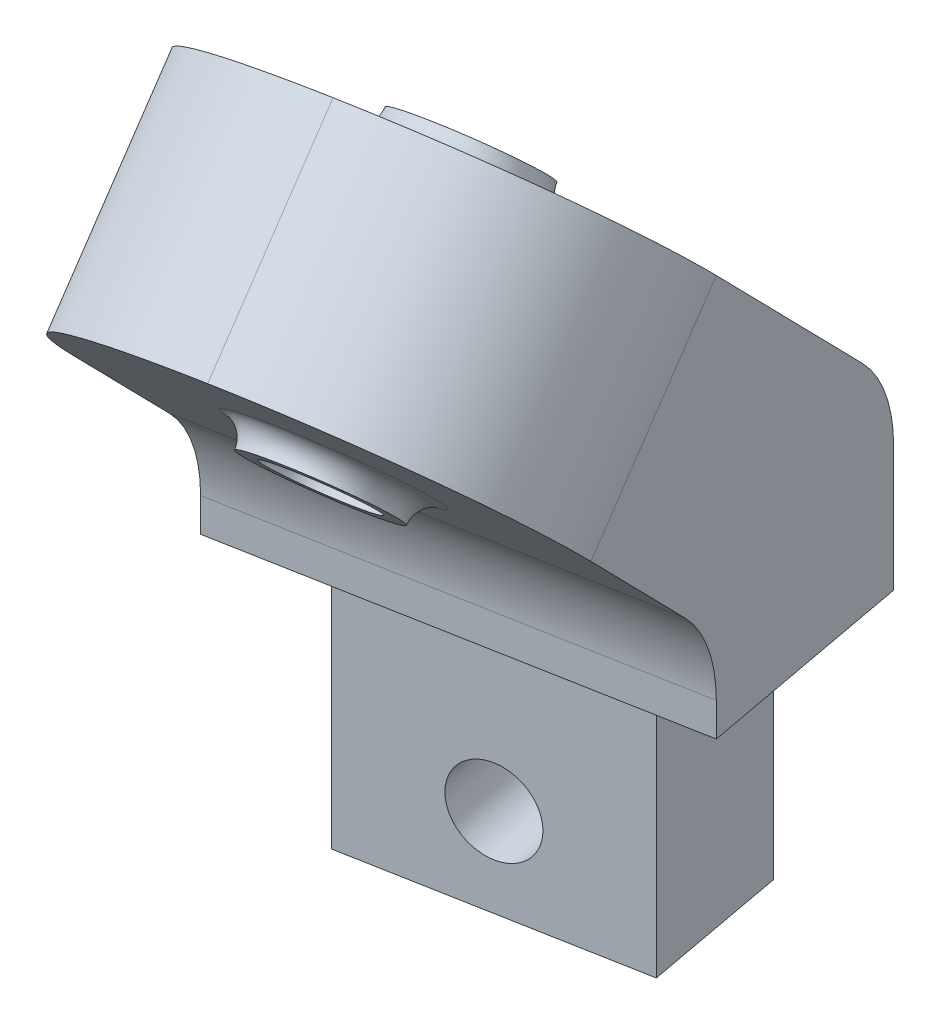
ISO-10303-21;
HEADER;
FILE_DESCRIPTION(('STEP AP214'),'2;1');
FILE_NAME('part.step','',(''),(''),'','','');
FILE_SCHEMA(('AUTOMOTIVE_DESIGN { 1 0 10303 214 1 1 1 1 }'));
ENDSEC;
DATA;
#1=APPLICATION_CONTEXT('core data for automotive mechanical design processes');
#2=APPLICATION_PROTOCOL_DEFINITION('international standard','automotive_design',2000,#1);
#3=PRODUCT_CONTEXT('',#1,'mechanical');
#4=PRODUCT('Part','Part','',(#3));
#5=PRODUCT_RELATED_PRODUCT_CATEGORY('part','',(#4));
#6=PRODUCT_DEFINITION_FORMATION('','',#4);
#7=PRODUCT_DEFINITION_CONTEXT('part definition',#1,'design');
#8=PRODUCT_DEFINITION('design','',#6,#7);
#9=PRODUCT_DEFINITION_SHAPE('','',#8);
#10=(LENGTH_UNIT() NAMED_UNIT(*) SI_UNIT(.MILLI.,.METRE.));
#11=(NAMED_UNIT(*) PLANE_ANGLE_UNIT() SI_UNIT($,.RADIAN.));
#12=(NAMED_UNIT(*) SI_UNIT($,.STERADIAN.) SOLID_ANGLE_UNIT());
#13=UNCERTAINTY_MEASURE_WITH_UNIT(LENGTH_MEASURE(1.E-05),#10,'distance_accuracy_value','');
#14=(GEOMETRIC_REPRESENTATION_CONTEXT(3) GLOBAL_UNCERTAINTY_ASSIGNED_CONTEXT((#13)) GLOBAL_UNIT_ASSIGNED_CONTEXT((#10,
#11,#12)) REPRESENTATION_CONTEXT('',''));
#15=CARTESIAN_POINT('',(0.,0.,0.));
#16=DIRECTION('',(0.,0.,1.));
#17=DIRECTION('',(1.,0.,0.));
#18=AXIS2_PLACEMENT_3D('',#15,#16,#17);
#19=CARTESIAN_POINT('',(-12.6979858774644,26.138265095319,58.6440209084636));
#20=DIRECTION('',(0.,-1.,0.));
#21=DIRECTION('',(-0.983304355644991,0.,0.181968525216835));
#22=AXIS2_PLACEMENT_3D('',#19,#20,#21);
#23=PLANE('',#22);
#24=DIRECTION('',(0.181968525216837,0.,0.98330435564499));
#25=VECTOR('',#24,1.);
#26=CARTESIAN_POINT('',(-5.65186015997738,26.138265095319,79.4085245715268));
#27=LINE('',#26,#25);
#28=CARTESIAN_POINT('',(-5.65186015997738,26.138265095319,79.4085245715268));
#29=VERTEX_POINT('',#28);
#30=CARTESIAN_POINT('',(-5.05136402676182,26.138265095319,82.6534289451553));
#31=VERTEX_POINT('',#30);
#32=EDGE_CURVE('E58',#29,#31,#27,.T.);
#33=ORIENTED_EDGE('',*,*,#32,.F.);
#34=DIRECTION('',(0.98330435564499,0.,-0.181968525216836));
#35=VECTOR('',#34,1.);
#36=CARTESIAN_POINT('',(-11.8466776005408,26.138265095319,80.5549262803929));
#37=LINE('',#36,#35);
#38=CARTESIAN_POINT('',(-11.8466776005408,26.138265095319,80.5549262803929));
#39=VERTEX_POINT('',#38);
#40=EDGE_CURVE('E62',#39,#29,#37,.T.);
#41=ORIENTED_EDGE('',*,*,#40,.F.);
#42=DIRECTION('',(-0.181968525216835,0.,-0.983304355644991));
#43=VECTOR('',#42,1.);
#44=CARTESIAN_POINT('',(-11.8466776005408,26.138265095319,80.5549262803929));
#45=LINE('',#44,#43);
#46=CARTESIAN_POINT('',(-11.2461814673253,26.138265095319,83.7998306540213));
#47=VERTEX_POINT('',#46);
#48=EDGE_CURVE('E376',#47,#39,#45,.T.);
#49=ORIENTED_EDGE('',*,*,#48,.F.);
#50=DIRECTION('',(-0.98330435564499,0.,0.181968525216836));
#51=VECTOR('',#50,1.);
#52=CARTESIAN_POINT('',(-11.2461814673253,26.138265095319,83.7998306540213));
#53=LINE('',#52,#51);
#54=EDGE_CURVE('E368',#31,#47,#53,.T.);
#55=ORIENTED_EDGE('',*,*,#54,.F.);
#56=EDGE_LOOP('',(#33,#41,#49,#55));
#57=FACE_BOUND('',#56,.T.);
#58=DIRECTION('',(0.983304355644991,0.,-0.181968525216835));
#59=VECTOR('',#58,1.);
#60=CARTESIAN_POINT('',(-3.05028244360175,26.138265095319,83.3000915291491));
#61=LINE('',#60,#59);
#62=CARTESIAN_POINT('',(-12.8833260000517,26.138265095319,85.1197767813175));
#63=VERTEX_POINT('',#62);
#64=CARTESIAN_POINT('',(-3.05028244360175,26.138265095319,83.3000915291491));
#65=VERTEX_POINT('',#64);
#66=EDGE_CURVE('E170',#63,#65,#61,.T.);
#67=ORIENTED_EDGE('',*,*,#66,.F.);
#68=DIRECTION('',(0.181968525216836,0.,0.98330435564499));
#69=VECTOR('',#68,1.);
#70=CARTESIAN_POINT('',(-13.9751371513527,26.138265095319,79.2199506474475));
#71=LINE('',#70,#69);
#72=CARTESIAN_POINT('',(-13.7931686261358,26.138265095319,80.2032550030925));
#73=VERTEX_POINT('',#72);
#74=EDGE_CURVE('E158',#73,#63,#71,.T.);
#75=ORIENTED_EDGE('',*,*,#74,.F.);
#76=DIRECTION('',(0.983304355644991,0.,-0.181968525216835));
#77=VECTOR('',#76,1.);
#78=CARTESIAN_POINT('',(-13.7931686261358,26.138265095319,80.2032550030925));
#79=LINE('',#78,#77);
#80=CARTESIAN_POINT('',(-3.96012506968593,26.138265095319,78.3835697509242));
#81=VERTEX_POINT('',#80);
#82=EDGE_CURVE('E214',#81,#73,#79,.F.);
#83=ORIENTED_EDGE('',*,*,#82,.F.);
#84=DIRECTION('',(-0.181968525216836,0.,-0.98330435564499));
#85=VECTOR('',#84,1.);
#86=CARTESIAN_POINT('',(-4.14209359490276,26.138265095319,77.4002653952792));
#87=LINE('',#86,#85);
#88=EDGE_CURVE('E161',#65,#81,#87,.T.);
#89=ORIENTED_EDGE('',*,*,#88,.F.);
#90=EDGE_LOOP('',(#67,#75,#83,#89));
#91=FACE_BOUND('',#90,.T.);
#92=ADVANCED_FACE('F41',(#57,#91),#23,.T.);
#93=CARTESIAN_POINT('',(-7.9668042218267,35.2093329071845,84.2099341552333));
#94=DIRECTION('',(0.128671178143339,-0.707106781186549,0.69530117784684));
#95=DIRECTION('',(0.12867117814334,0.707106781186546,0.695301177846843));
#96=AXIS2_PLACEMENT_3D('',#93,#94,#95);
#97=CYLINDRICAL_SURFACE('',#96,1.1);
#98=CARTESIAN_POINT('',(-7.25911274203834,31.3202456106585,88.034090633391));
#99=DIRECTION('',(0.128671178143339,-0.707106781186549,0.69530117784684));
#100=DIRECTION('',(0.12867117814334,0.707106781186546,0.695301177846843));
#101=AXIS2_PLACEMENT_3D('',#98,#99,#100);
#102=CIRCLE('',#101,1.1);
#103=CARTESIAN_POINT('',(-7.11757444608066,32.0980630699637,88.7989219290225));
#104=VERTEX_POINT('',#103);
#105=EDGE_CURVE('E232',#104,#104,#102,.T.);
#106=ORIENTED_EDGE('',*,*,#105,.T.);
#107=EDGE_LOOP('',(#106));
#108=FACE_BOUND('',#107,.T.);
#109=CARTESIAN_POINT('',(-8.03113981089837,35.5628862977778,83.8622835663099));
#110=DIRECTION('',(-0.128671178143339,0.707106781186549,-0.69530117784684));
#111=DIRECTION('',(-0.12867117814334,-0.707106781186546,-0.695301177846843));
#112=AXIS2_PLACEMENT_3D('',#109,#110,#111);
#113=CIRCLE('',#112,1.1);
#114=CARTESIAN_POINT('',(-8.17267810685605,34.7850688384726,83.0974522706784));
#115=VERTEX_POINT('',#114);
#116=EDGE_CURVE('E11',#115,#115,#113,.T.);
#117=ORIENTED_EDGE('',*,*,#116,.T.);
#118=EDGE_LOOP('',(#117));
#119=FACE_BOUND('',#118,.T.);
#120=ADVANCED_FACE('F283',(#108,#119),#97,.F.);
#121=CARTESIAN_POINT('',(-7.25911274203834,31.3202456106585,88.034090633391));
#122=DIRECTION('',(0.128671178143339,-0.707106781186549,0.69530117784684));
#123=DIRECTION('',(0.12867117814334,0.707106781186546,0.695301177846843));
#124=AXIS2_PLACEMENT_3D('',#121,#122,#123);
#125=PLANE('',#124);
#126=CARTESIAN_POINT('',(-7.25911274203834,31.3202456106585,88.034090633391));
#127=DIRECTION('',(0.128671178143339,-0.707106781186549,0.69530117784684));
#128=DIRECTION('',(0.12867117814334,0.707106781186546,0.695301177846843));
#129=AXIS2_PLACEMENT_3D('',#126,#127,#128);
#130=CIRCLE('',#129,1.5);
#131=CARTESIAN_POINT('',(-7.06610597482333,32.3809057824383,89.0770424001612));
#132=VERTEX_POINT('',#131);
#133=EDGE_CURVE('E198',#132,#132,#130,.T.);
#134=ORIENTED_EDGE('',*,*,#133,.T.);
#135=EDGE_LOOP('',(#134));
#136=FACE_BOUND('',#135,.T.);
#137=ORIENTED_EDGE('',*,*,#105,.F.);
#138=EDGE_LOOP('',(#137));
#139=FACE_BOUND('',#138,.T.);
#140=ADVANCED_FACE('F290',(#136,#139),#125,.T.);
#141=CARTESIAN_POINT('',(-8.03113981089837,35.5628862977778,83.8622835663099));
#142=DIRECTION('',(-0.128671178143339,0.707106781186549,-0.69530117784684));
#143=DIRECTION('',(-0.12867117814334,-0.707106781186546,-0.695301177846843));
#144=AXIS2_PLACEMENT_3D('',#141,#142,#143);
#145=PLANE('',#144);
#146=CARTESIAN_POINT('',(-8.03113981089837,35.5628862977778,83.8622835663099));
#147=DIRECTION('',(-0.128671178143339,0.707106781186549,-0.69530117784684));
#148=DIRECTION('',(-0.12867117814334,-0.707106781186546,-0.695301177846843));
#149=AXIS2_PLACEMENT_3D('',#146,#147,#148);
#150=CIRCLE('',#149,1.5);
#151=CARTESIAN_POINT('',(-8.22414657811338,34.502226125998,82.8193317995397));
#152=VERTEX_POINT('',#151);
#153=EDGE_CURVE('E50',#152,#152,#150,.T.);
#154=ORIENTED_EDGE('',*,*,#153,.T.);
#155=EDGE_LOOP('',(#154));
#156=FACE_BOUND('',#155,.T.);
#157=ORIENTED_EDGE('',*,*,#116,.F.);
#158=EDGE_LOOP('',(#157));
#159=FACE_BOUND('',#158,.T.);
#160=ADVANCED_FACE('F314',(#156,#159),#145,.T.);
#161=CARTESIAN_POINT('',(-7.25911274203834,31.3202456106585,88.034090633391));
#162=DIRECTION('',(0.128671178143339,-0.707106781186549,0.69530117784684));
#163=DIRECTION('',(0.12867117814334,0.707106781186546,0.695301177846843));
#164=AXIS2_PLACEMENT_3D('',#161,#162,#163);
#165=TOROIDAL_SURFACE('',#164,2.,0.5);
#166=CARTESIAN_POINT('',(-7.32344833111001,31.6737990012518,87.6864400444675));
#167=DIRECTION('',(0.128671178143339,-0.707106781186549,0.69530117784684));
#168=DIRECTION('',(0.12867117814334,0.707106781186546,0.695301177846843));
#169=AXIS2_PLACEMENT_3D('',#166,#167,#168);
#170=CIRCLE('',#169,2.);
#171=CARTESIAN_POINT('',(-7.06610597482333,33.0880125636249,89.0770424001612));
#172=VERTEX_POINT('',#171);
#173=EDGE_CURVE('E188',#172,#172,#170,.F.);
#174=ORIENTED_EDGE('',*,*,#173,.F.);
#175=EDGE_LOOP('',(#174));
#176=FACE_BOUND('',#175,.T.);
#177=ORIENTED_EDGE('',*,*,#133,.F.);
#178=EDGE_LOOP('',(#177));
#179=FACE_BOUND('',#178,.T.);
#180=ADVANCED_FACE('F317',(#176,#179),#165,.F.);
#181=CARTESIAN_POINT('',(-8.03113981089837,35.5628862977778,83.8622835663099));
#182=DIRECTION('',(-0.128671178143339,0.707106781186549,-0.69530117784684));
#183=DIRECTION('',(-0.12867117814334,-0.707106781186546,-0.695301177846843));
#184=AXIS2_PLACEMENT_3D('',#181,#182,#183);
#185=TOROIDAL_SURFACE('',#184,2.,0.5);
#186=CARTESIAN_POINT('',(-7.9668042218267,35.2093329071845,84.2099341552333));
#187=DIRECTION('',(-0.128671178143339,0.707106781186549,-0.69530117784684));
#188=DIRECTION('',(-0.12867117814334,-0.707106781186546,-0.695301177846843));
#189=AXIS2_PLACEMENT_3D('',#186,#187,#188);
#190=CIRCLE('',#189,2.);
#191=CARTESIAN_POINT('',(-8.22414657811338,33.7951193448114,82.8193317995397));
#192=VERTEX_POINT('',#191);
#193=EDGE_CURVE('E191',#192,#192,#190,.F.);
#194=ORIENTED_EDGE('',*,*,#193,.F.);
#195=EDGE_LOOP('',(#194));
#196=FACE_BOUND('',#195,.T.);
#197=ORIENTED_EDGE('',*,*,#153,.F.);
#198=EDGE_LOOP('',(#197));
#199=FACE_BOUND('',#198,.T.);
#200=ADVANCED_FACE('F322',(#196,#199),#185,.F.);
#201=CARTESIAN_POINT('',(-7.32344833111,31.6737990012518,87.6864400444675));
#202=DIRECTION('',(0.12867117814334,-0.707106781186548,0.695301177846841));
#203=DIRECTION('',(0.12867117814334,0.707106781186547,0.695301177846842));
#204=AXIS2_PLACEMENT_3D('',#201,#202,#203);
#205=CYLINDRICAL_SURFACE('',#204,5.);
#206=DIRECTION('',(0.12867117814334,-0.707106781186548,0.695301177846841));
#207=VECTOR('',#206,1.);
#208=CARTESIAN_POINT('',(-6.6800924403933,35.2093329071845,91.1629459337017));
#209=LINE('',#208,#207);
#210=CARTESIAN_POINT('',(-7.32344833111,38.7448668131172,87.6864400444675));
#211=VERTEX_POINT('',#210);
#212=CARTESIAN_POINT('',(-6.6800924403933,35.2093329071845,91.1629459337017));
#213=VERTEX_POINT('',#212);
#214=EDGE_CURVE('E195',#211,#213,#209,.T.);
#215=ORIENTED_EDGE('',*,*,#214,.F.);
#216=CARTESIAN_POINT('',(-7.9668042218267,35.2093329071845,84.2099341552333));
#217=DIRECTION('',(-0.128671178143339,0.707106781186549,-0.69530117784684));
#218=DIRECTION('',(-0.12867117814334,-0.707106781186546,-0.695301177846843));
#219=AXIS2_PLACEMENT_3D('',#216,#217,#218);
#220=CIRCLE('',#219,5.);
#221=CARTESIAN_POINT('',(-12.8833260000517,35.2093329071845,85.1197767813175));
#222=VERTEX_POINT('',#221);
#223=EDGE_CURVE('E205',#222,#211,#220,.T.);
#224=ORIENTED_EDGE('',*,*,#223,.F.);
#225=DIRECTION('',(0.12867117814334,-0.707106781186548,0.695301177846841));
#226=VECTOR('',#225,1.);
#227=CARTESIAN_POINT('',(-11.603080271076,28.1737990012517,92.0378479153092));
#228=LINE('',#227,#226);
#229=CARTESIAN_POINT('',(-12.239970109335,31.6737990012518,88.5962826705517));
#230=VERTEX_POINT('',#229);
#231=EDGE_CURVE('E194',#230,#222,#228,.F.);
#232=ORIENTED_EDGE('',*,*,#231,.F.);
#233=CARTESIAN_POINT('',(-7.32344833111,31.6737990012518,87.6864400444675));
#234=DIRECTION('',(0.128671178143339,-0.707106781186549,0.69530117784684));
#235=DIRECTION('',(0.12867117814334,0.707106781186546,0.695301177846843));
#236=AXIS2_PLACEMENT_3D('',#233,#234,#235);
#237=CIRCLE('',#236,5.);
#238=EDGE_CURVE('E209',#213,#230,#237,.T.);
#239=ORIENTED_EDGE('',*,*,#238,.F.);
#240=EDGE_LOOP('',(#215,#224,#232,#239));
#241=FACE_BOUND('',#240,.T.);
#242=ADVANCED_FACE('F268',(#241),#205,.T.);
#243=CARTESIAN_POINT('',(-12.8833260000517,28.138265095319,85.1197767813175));
#244=DIRECTION('',(0.128671178143339,-0.707106781186549,0.69530117784684));
#245=DIRECTION('',(0.12867117814334,0.707106781186546,0.695301177846843));
#246=AXIS2_PLACEMENT_3D('',#243,#244,#245);
#247=PLANE('',#246);
#248=ORIENTED_EDGE('',*,*,#173,.T.);
#249=EDGE_LOOP('',(#248));
#250=FACE_BOUND('',#249,.T.);
#251=DIRECTION('',(-0.12867117814334,-0.707106781186546,-0.695301177846843));
#252=VECTOR('',#251,1.);
#253=CARTESIAN_POINT('',(-12.8833260000517,28.138265095319,85.1197767813175));
#254=LINE('',#253,#252);
#255=CARTESIAN_POINT('',(-12.7234339588312,29.0169447517594,85.9837863147119));
#256=VERTEX_POINT('',#255);
#257=EDGE_CURVE('E215',#230,#256,#254,.T.);
#258=ORIENTED_EDGE('',*,*,#257,.T.);
#259=DIRECTION('',(0.983304355644991,0.,-0.181968525216835));
#260=VECTOR('',#259,1.);
#261=CARTESIAN_POINT('',(-2.89039040238127,29.0169447517594,84.1641010625436));
#262=LINE('',#261,#260);
#263=CARTESIAN_POINT('',(-2.89039040238127,29.0169447517594,84.1641010625436));
#264=VERTEX_POINT('',#263);
#265=EDGE_CURVE('E185',#256,#264,#262,.T.);
#266=ORIENTED_EDGE('',*,*,#265,.T.);
#267=DIRECTION('',(-0.12867117814334,-0.707106781186546,-0.695301177846843));
#268=VECTOR('',#267,1.);
#269=CARTESIAN_POINT('',(-3.05028244360175,28.138265095319,83.3000915291491));
#270=LINE('',#269,#268);
#271=CARTESIAN_POINT('',(-2.40692655288505,31.6737990012518,86.7765974183834));
#272=VERTEX_POINT('',#271);
#273=EDGE_CURVE('E223',#272,#264,#270,.T.);
#274=ORIENTED_EDGE('',*,*,#273,.F.);
#275=CARTESIAN_POINT('',(-7.32344833111,31.6737990012518,87.6864400444675));
#276=DIRECTION('',(0.128671178143339,-0.707106781186549,0.69530117784684));
#277=DIRECTION('',(0.12867117814334,0.707106781186546,0.695301177846843));
#278=AXIS2_PLACEMENT_3D('',#275,#276,#277);
#279=CIRCLE('',#278,5.);
#280=EDGE_CURVE('E207',#272,#213,#279,.T.);
#281=ORIENTED_EDGE('',*,*,#280,.T.);
#282=ORIENTED_EDGE('',*,*,#238,.T.);
#283=EDGE_LOOP('',(#258,#266,#274,#281,#282));
#284=FACE_BOUND('',#283,.T.);
#285=ADVANCED_FACE('F256',(#250,#284),#247,.T.);
#286=CARTESIAN_POINT('',(-6.68655849285108,28.1737990012518,91.128005289225));
#287=DIRECTION('',(0.12867117814334,-0.707106781186548,0.695301177846841));
#288=DIRECTION('',(0.12867117814334,0.707106781186547,0.695301177846842));
#289=AXIS2_PLACEMENT_3D('',#286,#287,#288);
#290=CYLINDRICAL_SURFACE('',#289,5.);
#291=CARTESIAN_POINT('',(-7.9668042218267,35.2093329071845,84.2099341552333));
#292=DIRECTION('',(-0.128671178143339,0.707106781186549,-0.69530117784684));
#293=DIRECTION('',(-0.12867117814334,-0.707106781186546,-0.695301177846843));
#294=AXIS2_PLACEMENT_3D('',#291,#292,#293);
#295=CIRCLE('',#294,5.);
#296=CARTESIAN_POINT('',(-3.05028244360175,35.2093329071845,83.3000915291492));
#297=VERTEX_POINT('',#296);
#298=EDGE_CURVE('E202',#211,#297,#295,.T.);
#299=ORIENTED_EDGE('',*,*,#298,.F.);
#300=ORIENTED_EDGE('',*,*,#214,.T.);
#301=ORIENTED_EDGE('',*,*,#280,.F.);
#302=DIRECTION('',(0.12867117814334,-0.707106781186548,0.695301177846841));
#303=VECTOR('',#302,1.);
#304=CARTESIAN_POINT('',(-1.77003671462612,28.1737990012518,90.2181626631408));
#305=LINE('',#304,#303);
#306=EDGE_CURVE('E211',#297,#272,#305,.T.);
#307=ORIENTED_EDGE('',*,*,#306,.F.);
#308=EDGE_LOOP('',(#299,#300,#301,#307));
#309=FACE_BOUND('',#308,.T.);
#310=ADVANCED_FACE('F263',(#309),#290,.T.);
#311=CARTESIAN_POINT('',(-12.239970109335,38.7448668131172,88.5962826705517));
#312=DIRECTION('',(-0.128671178143339,0.707106781186549,-0.69530117784684));
#313=DIRECTION('',(-0.12867117814334,-0.707106781186546,-0.695301177846843));
#314=AXIS2_PLACEMENT_3D('',#311,#312,#313);
#315=PLANE('',#314);
#316=ORIENTED_EDGE('',*,*,#193,.T.);
#317=EDGE_LOOP('',(#316));
#318=FACE_BOUND('',#317,.T.);
#319=DIRECTION('',(0.12867117814334,0.707106781186546,0.695301177846843));
#320=VECTOR('',#319,1.);
#321=CARTESIAN_POINT('',(-2.40692655288505,38.7448668131172,86.7765974183834));
#322=LINE('',#321,#320);
#323=CARTESIAN_POINT('',(-3.80023302846544,31.0880125636249,79.2475792843186));
#324=VERTEX_POINT('',#323);
#325=EDGE_CURVE('E226',#324,#297,#322,.T.);
#326=ORIENTED_EDGE('',*,*,#325,.F.);
#327=DIRECTION('',(0.983304355644991,0.,-0.181968525216835));
#328=VECTOR('',#327,1.);
#329=CARTESIAN_POINT('',(-13.6332765849153,31.0880125636249,81.067264536487));
#330=LINE('',#329,#328);
#331=CARTESIAN_POINT('',(-13.6332765849153,31.0880125636249,81.067264536487));
#332=VERTEX_POINT('',#331);
#333=EDGE_CURVE('E175',#324,#332,#330,.F.);
#334=ORIENTED_EDGE('',*,*,#333,.T.);
#335=DIRECTION('',(0.12867117814334,0.707106781186546,0.695301177846843));
#336=VECTOR('',#335,1.);
#337=CARTESIAN_POINT('',(-12.239970109335,38.7448668131172,88.5962826705517));
#338=LINE('',#337,#336);
#339=EDGE_CURVE('E218',#332,#222,#338,.T.);
#340=ORIENTED_EDGE('',*,*,#339,.T.);
#341=ORIENTED_EDGE('',*,*,#223,.T.);
#342=ORIENTED_EDGE('',*,*,#298,.T.);
#343=EDGE_LOOP('',(#326,#334,#340,#341,#342));
#344=FACE_BOUND('',#343,.T.);
#345=ADVANCED_FACE('F306',(#318,#344),#315,.T.);
#346=CARTESIAN_POINT('',(-12.3374204244012,26.8956244081997,88.0696898482525));
#347=DIRECTION('',(-0.983304355644991,0.,0.181968525216835));
#348=DIRECTION('',(0.,1.,0.));
#349=AXIS2_PLACEMENT_3D('',#346,#347,#348);
#350=CYLINDRICAL_SURFACE('',#349,3.);
#351=CARTESIAN_POINT('',(-12.3374204244011,26.8956244081997,88.0696898482525));
#352=DIRECTION('',(-0.98330435564499,0.,0.181968525216836));
#353=DIRECTION('',(-0.181968525216836,0.,-0.98330435564499));
#354=AXIS2_PLACEMENT_3D('',#351,#352,#353);
#355=CIRCLE('',#354,3.);
#356=CARTESIAN_POINT('',(-12.8833260000517,26.8956244081997,85.1197767813175));
#357=VERTEX_POINT('',#356);
#358=EDGE_CURVE('E167',#357,#256,#355,.F.);
#359=ORIENTED_EDGE('',*,*,#358,.F.);
#360=DIRECTION('',(0.983304355644991,0.,-0.181968525216835));
#361=VECTOR('',#360,1.);
#362=CARTESIAN_POINT('',(-12.8833260000517,26.8956244081997,85.1197767813175));
#363=LINE('',#362,#361);
#364=CARTESIAN_POINT('',(-3.05028244360175,26.8956244081997,83.3000915291491));
#365=VERTEX_POINT('',#364);
#366=EDGE_CURVE('E182',#365,#357,#363,.F.);
#367=ORIENTED_EDGE('',*,*,#366,.F.);
#368=CARTESIAN_POINT('',(-2.50437686795124,26.8956244081997,86.2500045960841));
#369=DIRECTION('',(0.98330435564499,0.,-0.181968525216836));
#370=DIRECTION('',(0.181968525216836,0.,0.98330435564499));
#371=AXIS2_PLACEMENT_3D('',#368,#369,#370);
#372=CIRCLE('',#371,3.);
#373=EDGE_CURVE('E169',#264,#365,#372,.F.);
#374=ORIENTED_EDGE('',*,*,#373,.F.);
#375=ORIENTED_EDGE('',*,*,#265,.F.);
#376=EDGE_LOOP('',(#359,#367,#374,#375));
#377=FACE_BOUND('',#376,.T.);
#378=ADVANCED_FACE('F253',(#377),#350,.F.);
#379=CARTESIAN_POINT('',(-4.14209359490276,15.138265095319,77.4002653952792));
#380=DIRECTION('',(0.98330435564499,0.,-0.181968525216836));
#381=DIRECTION('',(0.181968525216836,0.,0.98330435564499));
#382=AXIS2_PLACEMENT_3D('',#379,#380,#381);
#383=PLANE('',#382);
#384=DIRECTION('',(0.,1.,0.));
#385=VECTOR('',#384,1.);
#386=CARTESIAN_POINT('',(-3.05028244360175,15.138265095319,83.3000915291491));
#387=LINE('',#386,#385);
#388=EDGE_CURVE('E238',#65,#365,#387,.T.);
#389=ORIENTED_EDGE('',*,*,#388,.F.);
#390=ORIENTED_EDGE('',*,*,#88,.T.);
#391=DIRECTION('',(0.,1.,0.));
#392=VECTOR('',#391,1.);
#393=CARTESIAN_POINT('',(-3.96012506968593,30.2093329071845,78.3835697509242));
#394=LINE('',#393,#392);
#395=CARTESIAN_POINT('',(-3.96012506968593,28.9666922200652,78.3835697509242));
#396=VERTEX_POINT('',#395);
#397=EDGE_CURVE('E199',#81,#396,#394,.T.);
#398=ORIENTED_EDGE('',*,*,#397,.T.);
#399=CARTESIAN_POINT('',(-3.41421949403542,28.9666922200652,81.3334828178591));
#400=DIRECTION('',(0.98330435564499,0.,-0.181968525216836));
#401=DIRECTION('',(0.181968525216836,0.,0.98330435564499));
#402=AXIS2_PLACEMENT_3D('',#399,#400,#401);
#403=CIRCLE('',#402,3.);
#404=EDGE_CURVE('E177',#396,#324,#403,.T.);
#405=ORIENTED_EDGE('',*,*,#404,.T.);
#406=ORIENTED_EDGE('',*,*,#325,.T.);
#407=ORIENTED_EDGE('',*,*,#306,.T.);
#408=ORIENTED_EDGE('',*,*,#273,.T.);
#409=ORIENTED_EDGE('',*,*,#373,.T.);
#410=EDGE_LOOP('',(#389,#390,#398,#405,#406,#407,#408,#409));
#411=FACE_BOUND('',#410,.T.);
#412=ADVANCED_FACE('F258',(#411),#383,.T.);
#413=CARTESIAN_POINT('',(-13.2472630504853,28.9666922200652,83.1531680700275));
#414=DIRECTION('',(0.983304355644991,0.,-0.181968525216835));
#415=DIRECTION('',(0.,-1.,0.));
#416=AXIS2_PLACEMENT_3D('',#413,#414,#415);
#417=CYLINDRICAL_SURFACE('',#416,3.);
#418=CARTESIAN_POINT('',(-13.2472630504853,28.9666922200652,83.1531680700275));
#419=DIRECTION('',(-0.98330435564499,0.,0.181968525216836));
#420=DIRECTION('',(-0.181968525216836,0.,-0.98330435564499));
#421=AXIS2_PLACEMENT_3D('',#418,#419,#420);
#422=CIRCLE('',#421,3.);
#423=CARTESIAN_POINT('',(-13.7931686261358,28.9666922200652,80.2032550030925));
#424=VERTEX_POINT('',#423);
#425=EDGE_CURVE('E173',#332,#424,#422,.T.);
#426=ORIENTED_EDGE('',*,*,#425,.F.);
#427=ORIENTED_EDGE('',*,*,#333,.F.);
#428=ORIENTED_EDGE('',*,*,#404,.F.);
#429=DIRECTION('',(0.983304355644991,0.,-0.181968525216835));
#430=VECTOR('',#429,1.);
#431=CARTESIAN_POINT('',(-13.7931686261358,28.9666922200652,80.2032550030925));
#432=LINE('',#431,#430);
#433=EDGE_CURVE('E179',#424,#396,#432,.T.);
#434=ORIENTED_EDGE('',*,*,#433,.F.);
#435=EDGE_LOOP('',(#426,#427,#428,#434));
#436=FACE_BOUND('',#435,.T.);
#437=ADVANCED_FACE('F276',(#436),#417,.T.);
#438=CARTESIAN_POINT('',(-13.9751371513527,15.138265095319,79.2199506474475));
#439=DIRECTION('',(-0.98330435564499,0.,0.181968525216836));
#440=DIRECTION('',(-0.181968525216836,0.,-0.98330435564499));
#441=AXIS2_PLACEMENT_3D('',#438,#439,#440);
#442=PLANE('',#441);
#443=DIRECTION('',(0.,1.,0.));
#444=VECTOR('',#443,1.);
#445=CARTESIAN_POINT('',(-13.7931686261358,30.2093329071845,80.2032550030925));
#446=LINE('',#445,#444);
#447=EDGE_CURVE('E220',#73,#424,#446,.T.);
#448=ORIENTED_EDGE('',*,*,#447,.F.);
#449=ORIENTED_EDGE('',*,*,#74,.T.);
#450=DIRECTION('',(0.,1.,0.));
#451=VECTOR('',#450,1.);
#452=CARTESIAN_POINT('',(-12.8833260000517,15.138265095319,85.1197767813175));
#453=LINE('',#452,#451);
#454=EDGE_CURVE('E45',#63,#357,#453,.T.);
#455=ORIENTED_EDGE('',*,*,#454,.T.);
#456=ORIENTED_EDGE('',*,*,#358,.T.);
#457=ORIENTED_EDGE('',*,*,#257,.F.);
#458=ORIENTED_EDGE('',*,*,#231,.T.);
#459=ORIENTED_EDGE('',*,*,#339,.F.);
#460=ORIENTED_EDGE('',*,*,#425,.T.);
#461=EDGE_LOOP('',(#448,#449,#455,#456,#457,#458,#459,#460));
#462=FACE_BOUND('',#461,.T.);
#463=ADVANCED_FACE('F246',(#462),#442,.T.);
#464=CARTESIAN_POINT('',(-13.7931686261358,30.2093329071845,80.2032550030925));
#465=DIRECTION('',(-0.181968525216835,0.,-0.983304355644991));
#466=DIRECTION('',(0.,-1.,0.));
#467=AXIS2_PLACEMENT_3D('',#464,#465,#466);
#468=PLANE('',#467);
#469=ORIENTED_EDGE('',*,*,#447,.T.);
#470=ORIENTED_EDGE('',*,*,#433,.T.);
#471=ORIENTED_EDGE('',*,*,#397,.F.);
#472=ORIENTED_EDGE('',*,*,#82,.T.);
#473=EDGE_LOOP('',(#469,#470,#471,#472));
#474=FACE_BOUND('',#473,.T.);
#475=ADVANCED_FACE('F279',(#474),#468,.T.);
#476=CARTESIAN_POINT('',(-3.05028244360175,15.138265095319,83.3000915291491));
#477=DIRECTION('',(0.181968525216835,0.,0.983304355644991));
#478=DIRECTION('',(0.,1.,0.));
#479=AXIS2_PLACEMENT_3D('',#476,#477,#478);
#480=PLANE('',#479);
#481=ORIENTED_EDGE('',*,*,#454,.F.);
#482=ORIENTED_EDGE('',*,*,#66,.T.);
#483=ORIENTED_EDGE('',*,*,#388,.T.);
#484=ORIENTED_EDGE('',*,*,#366,.T.);
#485=EDGE_LOOP('',(#481,#482,#483,#484));
#486=FACE_BOUND('',#485,.T.);
#487=ADVANCED_FACE('F43',(#486),#480,.T.);
#488=CARTESIAN_POINT('',(-5.65186015997738,20.138265095319,79.4085245715268));
#489=DIRECTION('',(-0.98330435564499,0.,0.181968525216837));
#490=DIRECTION('',(0.181968525216837,0.,0.98330435564499));
#491=AXIS2_PLACEMENT_3D('',#488,#489,#490);
#492=PLANE('',#491);
#493=ORIENTED_EDGE('',*,*,#32,.T.);
#494=DIRECTION('',(0.,1.,0.));
#495=VECTOR('',#494,1.);
#496=CARTESIAN_POINT('',(-5.05136402676182,20.138265095319,82.6534289451553));
#497=LINE('',#496,#495);
#498=CARTESIAN_POINT('',(-5.05136402676182,20.138265095319,82.6534289451553));
#499=VERTEX_POINT('',#498);
#500=EDGE_CURVE('E141',#499,#31,#497,.T.);
#501=ORIENTED_EDGE('',*,*,#500,.F.);
#502=DIRECTION('',(0.181968525216837,0.,0.98330435564499));
#503=VECTOR('',#502,1.);
#504=CARTESIAN_POINT('',(-5.65186015997738,20.138265095319,79.4085245715268));
#505=LINE('',#504,#503);
#506=CARTESIAN_POINT('',(-5.65186015997738,20.138265095319,79.4085245715268));
#507=VERTEX_POINT('',#506);
#508=EDGE_CURVE('E147',#507,#499,#505,.T.);
#509=ORIENTED_EDGE('',*,*,#508,.F.);
#510=DIRECTION('',(0.,1.,0.));
#511=VECTOR('',#510,1.);
#512=CARTESIAN_POINT('',(-5.65186015997738,20.138265095319,79.4085245715268));
#513=LINE('',#512,#511);
#514=EDGE_CURVE('E373',#507,#29,#513,.T.);
#515=ORIENTED_EDGE('',*,*,#514,.T.);
#516=EDGE_LOOP('',(#493,#501,#509,#515));
#517=FACE_BOUND('',#516,.T.);
#518=ADVANCED_FACE('F157',(#517),#492,.F.);
#519=CARTESIAN_POINT('',(-11.2461814673253,20.138265095319,83.7998306540213));
#520=DIRECTION('',(-0.181968525216836,0.,-0.98330435564499));
#521=DIRECTION('',(-0.98330435564499,0.,0.181968525216836));
#522=AXIS2_PLACEMENT_3D('',#519,#520,#521);
#523=PLANE('',#522);
#524=CARTESIAN_POINT('',(-8.14877274704354,22.138265095319,83.2266297995883));
#525=DIRECTION('',(-0.181968525216836,0.,-0.98330435564499));
#526=DIRECTION('',(-0.98330435564499,0.,0.181968525216836));
#527=AXIS2_PLACEMENT_3D('',#524,#525,#526);
#528=CIRCLE('',#527,0.949999999999999);
#529=CARTESIAN_POINT('',(-9.08291188490628,22.138265095319,83.3994998985443));
#530=VERTEX_POINT('',#529);
#531=EDGE_CURVE('E366',#530,#530,#528,.T.);
#532=ORIENTED_EDGE('',*,*,#531,.T.);
#533=EDGE_LOOP('',(#532));
#534=FACE_BOUND('',#533,.T.);
#535=ORIENTED_EDGE('',*,*,#54,.T.);
#536=DIRECTION('',(0.,1.,0.));
#537=VECTOR('',#536,1.);
#538=CARTESIAN_POINT('',(-11.2461814673253,20.138265095319,83.7998306540213));
#539=LINE('',#538,#537);
#540=CARTESIAN_POINT('',(-11.2461814673253,20.138265095319,83.7998306540213));
#541=VERTEX_POINT('',#540);
#542=EDGE_CURVE('E143',#541,#47,#539,.T.);
#543=ORIENTED_EDGE('',*,*,#542,.F.);
#544=DIRECTION('',(-0.98330435564499,0.,0.181968525216836));
#545=VECTOR('',#544,1.);
#546=CARTESIAN_POINT('',(-11.2461814673253,20.138265095319,83.7998306540213));
#547=LINE('',#546,#545);
#548=EDGE_CURVE('E136',#499,#541,#547,.T.);
#549=ORIENTED_EDGE('',*,*,#548,.F.);
#550=ORIENTED_EDGE('',*,*,#500,.T.);
#551=EDGE_LOOP('',(#535,#543,#549,#550));
#552=FACE_BOUND('',#551,.T.);
#553=ADVANCED_FACE('F139',(#534,#552),#523,.F.);
#554=CARTESIAN_POINT('',(-11.8466776005408,20.138265095319,80.5549262803929));
#555=DIRECTION('',(0.983304355644991,0.,-0.181968525216835));
#556=DIRECTION('',(-0.181968525216835,0.,-0.983304355644991));
#557=AXIS2_PLACEMENT_3D('',#554,#555,#556);
#558=PLANE('',#557);
#559=ORIENTED_EDGE('',*,*,#48,.T.);
#560=DIRECTION('',(0.,1.,0.));
#561=VECTOR('',#560,1.);
#562=CARTESIAN_POINT('',(-11.8466776005408,20.138265095319,80.5549262803929));
#563=LINE('',#562,#561);
#564=CARTESIAN_POINT('',(-11.8466776005408,20.138265095319,80.5549262803929));
#565=VERTEX_POINT('',#564);
#566=EDGE_CURVE('E163',#565,#39,#563,.T.);
#567=ORIENTED_EDGE('',*,*,#566,.F.);
#568=DIRECTION('',(-0.181968525216835,0.,-0.983304355644991));
#569=VECTOR('',#568,1.);
#570=CARTESIAN_POINT('',(-11.8466776005408,20.138265095319,80.5549262803929));
#571=LINE('',#570,#569);
#572=EDGE_CURVE('E146',#541,#565,#571,.T.);
#573=ORIENTED_EDGE('',*,*,#572,.F.);
#574=ORIENTED_EDGE('',*,*,#542,.T.);
#575=EDGE_LOOP('',(#559,#567,#573,#574));
#576=FACE_BOUND('',#575,.T.);
#577=ADVANCED_FACE('F344',(#576),#558,.F.);
#578=CARTESIAN_POINT('',(-11.8466776005408,20.138265095319,80.5549262803929));
#579=DIRECTION('',(0.181968525216836,0.,0.98330435564499));
#580=DIRECTION('',(0.98330435564499,0.,-0.181968525216836));
#581=AXIS2_PLACEMENT_3D('',#578,#579,#580);
#582=PLANE('',#581);
#583=CARTESIAN_POINT('',(-8.7492688802591,22.138265095319,79.9817254259599));
#584=DIRECTION('',(-0.181968525216836,0.,-0.98330435564499));
#585=DIRECTION('',(-0.98330435564499,0.,0.181968525216836));
#586=AXIS2_PLACEMENT_3D('',#583,#584,#585);
#587=CIRCLE('',#586,0.949999999999999);
#588=CARTESIAN_POINT('',(-9.68340801812183,22.138265095319,80.1545955249159));
#589=VERTEX_POINT('',#588);
#590=EDGE_CURVE('E363',#589,#589,#587,.T.);
#591=ORIENTED_EDGE('',*,*,#590,.F.);
#592=EDGE_LOOP('',(#591));
#593=FACE_BOUND('',#592,.T.);
#594=ORIENTED_EDGE('',*,*,#40,.T.);
#595=ORIENTED_EDGE('',*,*,#514,.F.);
#596=DIRECTION('',(0.98330435564499,0.,-0.181968525216836));
#597=VECTOR('',#596,1.);
#598=CARTESIAN_POINT('',(-11.8466776005408,20.138265095319,80.5549262803929));
#599=LINE('',#598,#597);
#600=EDGE_CURVE('E152',#565,#507,#599,.T.);
#601=ORIENTED_EDGE('',*,*,#600,.F.);
#602=ORIENTED_EDGE('',*,*,#566,.T.);
#603=EDGE_LOOP('',(#594,#595,#601,#602));
#604=FACE_BOUND('',#603,.T.);
#605=ADVANCED_FACE('F348',(#593,#604),#582,.F.);
#606=CARTESIAN_POINT('',(0.,20.138265095319,0.));
#607=DIRECTION('',(0.,1.,0.));
#608=DIRECTION('',(0.,0.,1.));
#609=AXIS2_PLACEMENT_3D('',#606,#607,#608);
#610=PLANE('',#609);
#611=ORIENTED_EDGE('',*,*,#508,.T.);
#612=ORIENTED_EDGE('',*,*,#548,.T.);
#613=ORIENTED_EDGE('',*,*,#572,.T.);
#614=ORIENTED_EDGE('',*,*,#600,.T.);
#615=EDGE_LOOP('',(#611,#612,#613,#614));
#616=FACE_BOUND('',#615,.T.);
#617=ADVANCED_FACE('F150',(#616),#610,.F.);
#618=CARTESIAN_POINT('',(-7.65745772895808,22.138265095319,85.8815515598298));
#619=DIRECTION('',(-0.181968525216836,0.,-0.98330435564499));
#620=DIRECTION('',(-0.98330435564499,0.,0.181968525216836));
#621=AXIS2_PLACEMENT_3D('',#618,#619,#620);
#622=CYLINDRICAL_SURFACE('',#621,0.949999999999999);
#623=ORIENTED_EDGE('',*,*,#590,.T.);
#624=EDGE_LOOP('',(#623));
#625=FACE_BOUND('',#624,.T.);
#626=ORIENTED_EDGE('',*,*,#531,.F.);
#627=EDGE_LOOP('',(#626));
#628=FACE_BOUND('',#627,.T.);
#629=ADVANCED_FACE('F355',(#625,#628),#622,.F.);
#630=CLOSED_SHELL('',(#92,#120,#140,#160,#180,#200,#242,#285,#310,#345,#378,#412,#437,#463,#475,
#487,#518,#553,#577,#605,#617,#629));
#631=MANIFOLD_SOLID_BREP('B2',#630);
#632=ADVANCED_BREP_SHAPE_REPRESENTATION('',(#18,#631),#14);
#633=SHAPE_DEFINITION_REPRESENTATION(#9,#632);
ENDSEC;
END-ISO-10303-21;
